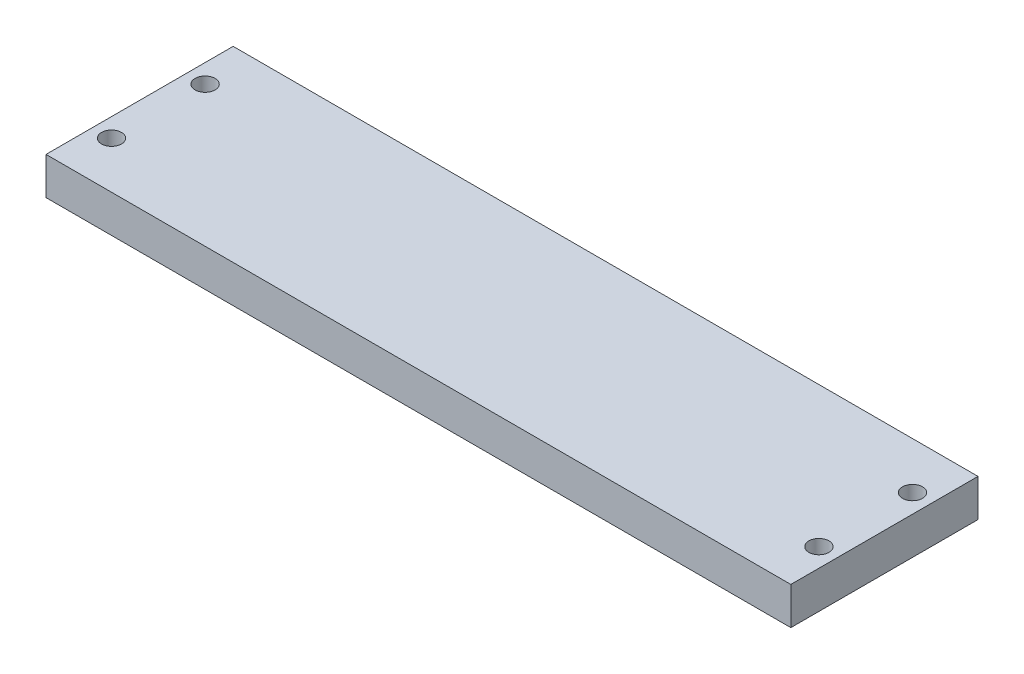
ISO-10303-21;
HEADER;
FILE_DESCRIPTION(('STEP AP214'),'2;1');
FILE_NAME('part.step','',(''),(''),'','','');
FILE_SCHEMA(('AUTOMOTIVE_DESIGN { 1 0 10303 214 1 1 1 1 }'));
ENDSEC;
DATA;
#1=APPLICATION_CONTEXT('core data for automotive mechanical design processes');
#2=APPLICATION_PROTOCOL_DEFINITION('international standard','automotive_design',2000,#1);
#3=PRODUCT_CONTEXT('',#1,'mechanical');
#4=PRODUCT('Part','Part','',(#3));
#5=PRODUCT_RELATED_PRODUCT_CATEGORY('part','',(#4));
#6=PRODUCT_DEFINITION_FORMATION('','',#4);
#7=PRODUCT_DEFINITION_CONTEXT('part definition',#1,'design');
#8=PRODUCT_DEFINITION('design','',#6,#7);
#9=PRODUCT_DEFINITION_SHAPE('','',#8);
#10=(LENGTH_UNIT() NAMED_UNIT(*) SI_UNIT(.MILLI.,.METRE.));
#11=(NAMED_UNIT(*) PLANE_ANGLE_UNIT() SI_UNIT($,.RADIAN.));
#12=(NAMED_UNIT(*) SI_UNIT($,.STERADIAN.) SOLID_ANGLE_UNIT());
#13=UNCERTAINTY_MEASURE_WITH_UNIT(LENGTH_MEASURE(1.E-05),#10,'distance_accuracy_value','');
#14=(GEOMETRIC_REPRESENTATION_CONTEXT(3) GLOBAL_UNCERTAINTY_ASSIGNED_CONTEXT((#13)) GLOBAL_UNIT_ASSIGNED_CONTEXT((#10,
#11,#12)) REPRESENTATION_CONTEXT('',''));
#15=CARTESIAN_POINT('',(0.,0.,0.));
#16=DIRECTION('',(0.,0.,1.));
#17=DIRECTION('',(1.,0.,0.));
#18=AXIS2_PLACEMENT_3D('',#15,#16,#17);
#19=CARTESIAN_POINT('',(-132.163963312393,12.7,185.574932993126));
#20=DIRECTION('',(1.,0.,0.));
#21=DIRECTION('',(0.,0.,-1.));
#22=AXIS2_PLACEMENT_3D('',#19,#20,#21);
#23=PLANE('',#22);
#24=DIRECTION('',(0.,0.,1.));
#25=VECTOR('',#24,1.);
#26=CARTESIAN_POINT('',(-132.163963312393,0.,185.574932993126));
#27=LINE('',#26,#25);
#28=CARTESIAN_POINT('',(-132.163963312393,0.,185.574932993126));
#29=VERTEX_POINT('',#28);
#30=CARTESIAN_POINT('',(-132.163963312393,0.,249.074932993126));
#31=VERTEX_POINT('',#30);
#32=EDGE_CURVE('E95',#29,#31,#27,.T.);
#33=ORIENTED_EDGE('',*,*,#32,.T.);
#34=DIRECTION('',(0.,-1.,0.));
#35=VECTOR('',#34,1.);
#36=CARTESIAN_POINT('',(-132.163963312393,12.7,249.074932993126));
#37=LINE('',#36,#35);
#38=CARTESIAN_POINT('',(-132.163963312393,12.7,249.074932993126));
#39=VERTEX_POINT('',#38);
#40=EDGE_CURVE('E11',#39,#31,#37,.T.);
#41=ORIENTED_EDGE('',*,*,#40,.F.);
#42=DIRECTION('',(0.,0.,1.));
#43=VECTOR('',#42,1.);
#44=CARTESIAN_POINT('',(-132.163963312393,12.7,185.574932993126));
#45=LINE('',#44,#43);
#46=CARTESIAN_POINT('',(-132.163963312393,12.7,185.574932993126));
#47=VERTEX_POINT('',#46);
#48=EDGE_CURVE('E83',#47,#39,#45,.T.);
#49=ORIENTED_EDGE('',*,*,#48,.F.);
#50=DIRECTION('',(0.,-1.,0.));
#51=VECTOR('',#50,1.);
#52=CARTESIAN_POINT('',(-132.163963312393,12.7,185.574932993126));
#53=LINE('',#52,#51);
#54=EDGE_CURVE('E91',#47,#29,#53,.T.);
#55=ORIENTED_EDGE('',*,*,#54,.T.);
#56=EDGE_LOOP('',(#33,#41,#49,#55));
#57=FACE_BOUND('',#56,.T.);
#58=ADVANCED_FACE('F32',(#57),#23,.F.);
#59=CARTESIAN_POINT('',(-132.163963312393,12.7,249.074932993126));
#60=DIRECTION('',(0.,0.,-1.));
#61=DIRECTION('',(-1.,0.,0.));
#62=AXIS2_PLACEMENT_3D('',#59,#60,#61);
#63=PLANE('',#62);
#64=DIRECTION('',(1.,0.,0.));
#65=VECTOR('',#64,1.);
#66=CARTESIAN_POINT('',(-132.163963312393,0.,249.074932993126));
#67=LINE('',#66,#65);
#68=CARTESIAN_POINT('',(120.536036687606,0.,249.074932993126));
#69=VERTEX_POINT('',#68);
#70=EDGE_CURVE('E87',#31,#69,#67,.T.);
#71=ORIENTED_EDGE('',*,*,#70,.T.);
#72=DIRECTION('',(0.,-1.,0.));
#73=VECTOR('',#72,1.);
#74=CARTESIAN_POINT('',(120.536036687606,12.7,249.074932993126));
#75=LINE('',#74,#73);
#76=CARTESIAN_POINT('',(120.536036687606,12.7,249.074932993126));
#77=VERTEX_POINT('',#76);
#78=EDGE_CURVE('E40',#77,#69,#75,.T.);
#79=ORIENTED_EDGE('',*,*,#78,.F.);
#80=DIRECTION('',(1.,0.,0.));
#81=VECTOR('',#80,1.);
#82=CARTESIAN_POINT('',(-132.163963312393,12.7,249.074932993126));
#83=LINE('',#82,#81);
#84=EDGE_CURVE('E78',#39,#77,#83,.T.);
#85=ORIENTED_EDGE('',*,*,#84,.F.);
#86=ORIENTED_EDGE('',*,*,#40,.T.);
#87=EDGE_LOOP('',(#71,#79,#85,#86));
#88=FACE_BOUND('',#87,.T.);
#89=ADVANCED_FACE('F86',(#88),#63,.F.);
#90=CARTESIAN_POINT('',(120.536036687606,12.7,185.574932993126));
#91=DIRECTION('',(-1.,0.,0.));
#92=DIRECTION('',(0.,0.,1.));
#93=AXIS2_PLACEMENT_3D('',#90,#91,#92);
#94=PLANE('',#93);
#95=DIRECTION('',(0.,0.,-1.));
#96=VECTOR('',#95,1.);
#97=CARTESIAN_POINT('',(120.536036687606,0.,185.574932993126));
#98=LINE('',#97,#96);
#99=CARTESIAN_POINT('',(120.536036687606,0.,185.574932993126));
#100=VERTEX_POINT('',#99);
#101=EDGE_CURVE('E65',#69,#100,#98,.T.);
#102=ORIENTED_EDGE('',*,*,#101,.T.);
#103=DIRECTION('',(0.,-1.,0.));
#104=VECTOR('',#103,1.);
#105=CARTESIAN_POINT('',(120.536036687606,12.7,185.574932993126));
#106=LINE('',#105,#104);
#107=CARTESIAN_POINT('',(120.536036687606,12.7,185.574932993126));
#108=VERTEX_POINT('',#107);
#109=EDGE_CURVE('E88',#108,#100,#106,.T.);
#110=ORIENTED_EDGE('',*,*,#109,.F.);
#111=DIRECTION('',(0.,0.,-1.));
#112=VECTOR('',#111,1.);
#113=CARTESIAN_POINT('',(120.536036687606,12.7,185.574932993126));
#114=LINE('',#113,#112);
#115=EDGE_CURVE('E81',#77,#108,#114,.T.);
#116=ORIENTED_EDGE('',*,*,#115,.F.);
#117=ORIENTED_EDGE('',*,*,#78,.T.);
#118=EDGE_LOOP('',(#102,#110,#116,#117));
#119=FACE_BOUND('',#118,.T.);
#120=ADVANCED_FACE('F89',(#119),#94,.F.);
#121=CARTESIAN_POINT('',(-132.163963312393,12.7,185.574932993126));
#122=DIRECTION('',(0.,0.,1.));
#123=DIRECTION('',(1.,0.,0.));
#124=AXIS2_PLACEMENT_3D('',#121,#122,#123);
#125=PLANE('',#124);
#126=DIRECTION('',(-1.,0.,0.));
#127=VECTOR('',#126,1.);
#128=CARTESIAN_POINT('',(-132.163963312393,0.,185.574932993126));
#129=LINE('',#128,#127);
#130=EDGE_CURVE('E71',#100,#29,#129,.T.);
#131=ORIENTED_EDGE('',*,*,#130,.T.);
#132=ORIENTED_EDGE('',*,*,#54,.F.);
#133=DIRECTION('',(-1.,0.,0.));
#134=VECTOR('',#133,1.);
#135=CARTESIAN_POINT('',(-132.163963312393,12.7,185.574932993126));
#136=LINE('',#135,#134);
#137=EDGE_CURVE('E48',#108,#47,#136,.T.);
#138=ORIENTED_EDGE('',*,*,#137,.F.);
#139=ORIENTED_EDGE('',*,*,#109,.T.);
#140=EDGE_LOOP('',(#131,#132,#138,#139));
#141=FACE_BOUND('',#140,.T.);
#142=ADVANCED_FACE('F103',(#141),#125,.F.);
#143=CARTESIAN_POINT('',(-132.163963312393,12.7,249.074932993126));
#144=DIRECTION('',(0.,1.,0.));
#145=DIRECTION('',(0.,0.,1.));
#146=AXIS2_PLACEMENT_3D('',#143,#144,#145);
#147=PLANE('',#146);
#148=CARTESIAN_POINT('',(-125.813963312393,12.7,201.449932993126));
#149=DIRECTION('',(0.,1.,0.));
#150=DIRECTION('',(0.,0.,1.));
#151=AXIS2_PLACEMENT_3D('',#148,#149,#150);
#152=CIRCLE('',#151,3.39999999999999);
#153=CARTESIAN_POINT('',(-125.813963312393,12.7,204.849932993126));
#154=VERTEX_POINT('',#153);
#155=EDGE_CURVE('E129',#154,#154,#152,.T.);
#156=ORIENTED_EDGE('',*,*,#155,.F.);
#157=EDGE_LOOP('',(#156));
#158=FACE_BOUND('',#157,.T.);
#159=CARTESIAN_POINT('',(-125.813963312393,12.7,233.199932993126));
#160=DIRECTION('',(0.,1.,0.));
#161=DIRECTION('',(0.,0.,1.));
#162=AXIS2_PLACEMENT_3D('',#159,#160,#161);
#163=CIRCLE('',#162,3.39999999999999);
#164=CARTESIAN_POINT('',(-125.813963312393,12.7,236.599932993126));
#165=VERTEX_POINT('',#164);
#166=EDGE_CURVE('E123',#165,#165,#163,.T.);
#167=ORIENTED_EDGE('',*,*,#166,.F.);
#168=EDGE_LOOP('',(#167));
#169=FACE_BOUND('',#168,.T.);
#170=CARTESIAN_POINT('',(114.186036687606,12.7,201.449932993126));
#171=DIRECTION('',(0.,1.,0.));
#172=DIRECTION('',(0.,0.,1.));
#173=AXIS2_PLACEMENT_3D('',#170,#171,#172);
#174=CIRCLE('',#173,3.39999999999999);
#175=CARTESIAN_POINT('',(114.186036687606,12.7,204.849932993126));
#176=VERTEX_POINT('',#175);
#177=EDGE_CURVE('E117',#176,#176,#174,.T.);
#178=ORIENTED_EDGE('',*,*,#177,.F.);
#179=EDGE_LOOP('',(#178));
#180=FACE_BOUND('',#179,.T.);
#181=CARTESIAN_POINT('',(114.186036687606,12.7,233.199932993126));
#182=DIRECTION('',(0.,1.,0.));
#183=DIRECTION('',(0.,0.,1.));
#184=AXIS2_PLACEMENT_3D('',#181,#182,#183);
#185=CIRCLE('',#184,3.39999999999999);
#186=CARTESIAN_POINT('',(114.186036687606,12.7,236.599932993126));
#187=VERTEX_POINT('',#186);
#188=EDGE_CURVE('E111',#187,#187,#185,.T.);
#189=ORIENTED_EDGE('',*,*,#188,.F.);
#190=EDGE_LOOP('',(#189));
#191=FACE_BOUND('',#190,.T.);
#192=ORIENTED_EDGE('',*,*,#48,.T.);
#193=ORIENTED_EDGE('',*,*,#84,.T.);
#194=ORIENTED_EDGE('',*,*,#115,.T.);
#195=ORIENTED_EDGE('',*,*,#137,.T.);
#196=EDGE_LOOP('',(#192,#193,#194,#195));
#197=FACE_BOUND('',#196,.T.);
#198=ADVANCED_FACE('F79',(#158,#169,#180,#191,#197),#147,.T.);
#199=CARTESIAN_POINT('',(-132.163963312393,0.,249.074932993126));
#200=DIRECTION('',(0.,1.,0.));
#201=DIRECTION('',(0.,0.,1.));
#202=AXIS2_PLACEMENT_3D('',#199,#200,#201);
#203=PLANE('',#202);
#204=CARTESIAN_POINT('',(-125.813963312393,0.,201.449932993126));
#205=DIRECTION('',(0.,1.,0.));
#206=DIRECTION('',(0.,0.,1.));
#207=AXIS2_PLACEMENT_3D('',#204,#205,#206);
#208=CIRCLE('',#207,3.39999999999999);
#209=CARTESIAN_POINT('',(-125.813963312393,0.,204.849932993126));
#210=VERTEX_POINT('',#209);
#211=EDGE_CURVE('E126',#210,#210,#208,.T.);
#212=ORIENTED_EDGE('',*,*,#211,.T.);
#213=EDGE_LOOP('',(#212));
#214=FACE_BOUND('',#213,.T.);
#215=CARTESIAN_POINT('',(-125.813963312393,0.,233.199932993126));
#216=DIRECTION('',(0.,1.,0.));
#217=DIRECTION('',(0.,0.,1.));
#218=AXIS2_PLACEMENT_3D('',#215,#216,#217);
#219=CIRCLE('',#218,3.39999999999999);
#220=CARTESIAN_POINT('',(-125.813963312393,0.,236.599932993126));
#221=VERTEX_POINT('',#220);
#222=EDGE_CURVE('E120',#221,#221,#219,.T.);
#223=ORIENTED_EDGE('',*,*,#222,.T.);
#224=EDGE_LOOP('',(#223));
#225=FACE_BOUND('',#224,.T.);
#226=CARTESIAN_POINT('',(114.186036687606,0.,201.449932993126));
#227=DIRECTION('',(0.,1.,0.));
#228=DIRECTION('',(0.,0.,1.));
#229=AXIS2_PLACEMENT_3D('',#226,#227,#228);
#230=CIRCLE('',#229,3.39999999999999);
#231=CARTESIAN_POINT('',(114.186036687606,0.,204.849932993126));
#232=VERTEX_POINT('',#231);
#233=EDGE_CURVE('E114',#232,#232,#230,.T.);
#234=ORIENTED_EDGE('',*,*,#233,.T.);
#235=EDGE_LOOP('',(#234));
#236=FACE_BOUND('',#235,.T.);
#237=CARTESIAN_POINT('',(114.186036687606,0.,233.199932993126));
#238=DIRECTION('',(0.,1.,0.));
#239=DIRECTION('',(0.,0.,1.));
#240=AXIS2_PLACEMENT_3D('',#237,#238,#239);
#241=CIRCLE('',#240,3.39999999999999);
#242=CARTESIAN_POINT('',(114.186036687606,0.,236.599932993126));
#243=VERTEX_POINT('',#242);
#244=EDGE_CURVE('E98',#243,#243,#241,.T.);
#245=ORIENTED_EDGE('',*,*,#244,.T.);
#246=EDGE_LOOP('',(#245));
#247=FACE_BOUND('',#246,.T.);
#248=ORIENTED_EDGE('',*,*,#32,.F.);
#249=ORIENTED_EDGE('',*,*,#130,.F.);
#250=ORIENTED_EDGE('',*,*,#101,.F.);
#251=ORIENTED_EDGE('',*,*,#70,.F.);
#252=EDGE_LOOP('',(#248,#249,#250,#251));
#253=FACE_BOUND('',#252,.T.);
#254=ADVANCED_FACE('F106',(#214,#225,#236,#247,#253),#203,.F.);
#255=CARTESIAN_POINT('',(114.186036687606,12.7,233.199932993126));
#256=DIRECTION('',(0.,1.,0.));
#257=DIRECTION('',(0.,0.,1.));
#258=AXIS2_PLACEMENT_3D('',#255,#256,#257);
#259=CYLINDRICAL_SURFACE('',#258,3.39999999999999);
#260=ORIENTED_EDGE('',*,*,#188,.T.);
#261=EDGE_LOOP('',(#260));
#262=FACE_BOUND('',#261,.T.);
#263=ORIENTED_EDGE('',*,*,#244,.F.);
#264=EDGE_LOOP('',(#263));
#265=FACE_BOUND('',#264,.T.);
#266=ADVANCED_FACE('F145',(#262,#265),#259,.F.);
#267=CARTESIAN_POINT('',(114.186036687606,12.7,201.449932993126));
#268=DIRECTION('',(0.,1.,0.));
#269=DIRECTION('',(0.,0.,1.));
#270=AXIS2_PLACEMENT_3D('',#267,#268,#269);
#271=CYLINDRICAL_SURFACE('',#270,3.39999999999999);
#272=ORIENTED_EDGE('',*,*,#177,.T.);
#273=EDGE_LOOP('',(#272));
#274=FACE_BOUND('',#273,.T.);
#275=ORIENTED_EDGE('',*,*,#233,.F.);
#276=EDGE_LOOP('',(#275));
#277=FACE_BOUND('',#276,.T.);
#278=ADVANCED_FACE('F148',(#274,#277),#271,.F.);
#279=CARTESIAN_POINT('',(-125.813963312393,12.7,233.199932993126));
#280=DIRECTION('',(0.,1.,0.));
#281=DIRECTION('',(0.,0.,1.));
#282=AXIS2_PLACEMENT_3D('',#279,#280,#281);
#283=CYLINDRICAL_SURFACE('',#282,3.39999999999999);
#284=ORIENTED_EDGE('',*,*,#166,.T.);
#285=EDGE_LOOP('',(#284));
#286=FACE_BOUND('',#285,.T.);
#287=ORIENTED_EDGE('',*,*,#222,.F.);
#288=EDGE_LOOP('',(#287));
#289=FACE_BOUND('',#288,.T.);
#290=ADVANCED_FACE('F195',(#286,#289),#283,.F.);
#291=CARTESIAN_POINT('',(-125.813963312393,12.7,201.449932993126));
#292=DIRECTION('',(0.,1.,0.));
#293=DIRECTION('',(0.,0.,1.));
#294=AXIS2_PLACEMENT_3D('',#291,#292,#293);
#295=CYLINDRICAL_SURFACE('',#294,3.39999999999999);
#296=ORIENTED_EDGE('',*,*,#155,.T.);
#297=EDGE_LOOP('',(#296));
#298=FACE_BOUND('',#297,.T.);
#299=ORIENTED_EDGE('',*,*,#211,.F.);
#300=EDGE_LOOP('',(#299));
#301=FACE_BOUND('',#300,.T.);
#302=ADVANCED_FACE('F133',(#298,#301),#295,.F.);
#303=CLOSED_SHELL('',(#58,#89,#120,#142,#198,#254,#266,#278,#290,#302));
#304=MANIFOLD_SOLID_BREP('B2',#303);
#305=ADVANCED_BREP_SHAPE_REPRESENTATION('',(#18,#304),#14);
#306=SHAPE_DEFINITION_REPRESENTATION(#9,#305);
ENDSEC;
END-ISO-10303-21;
